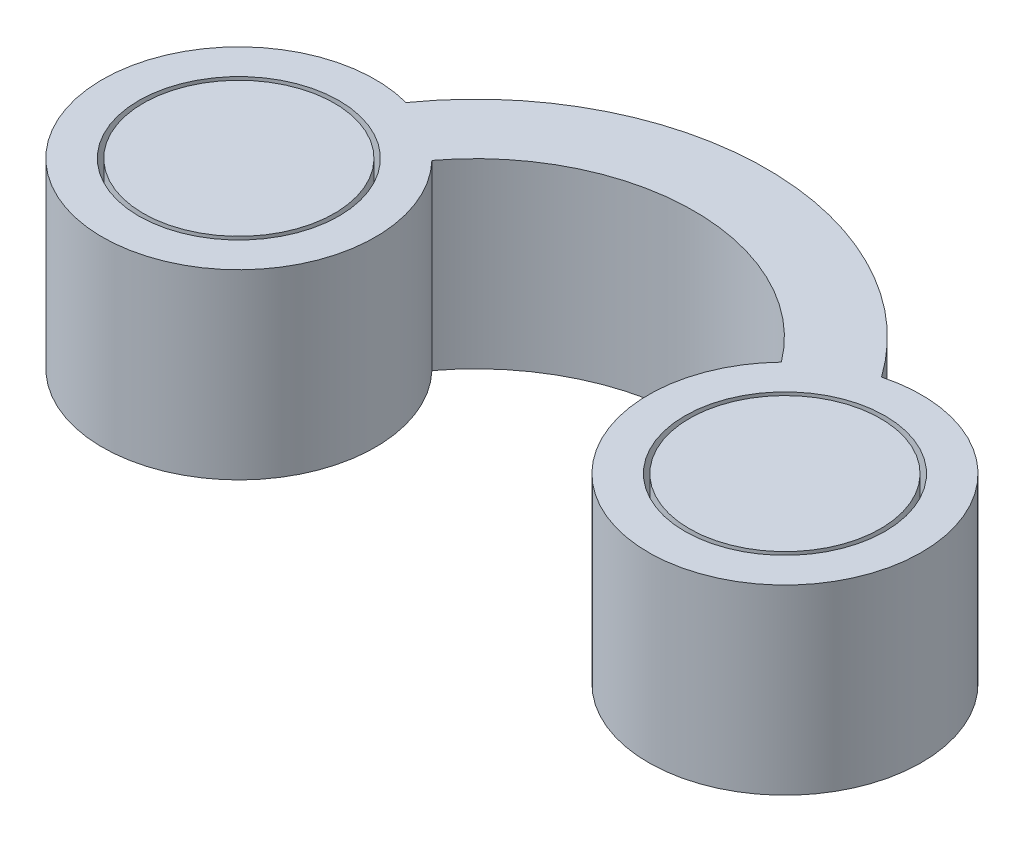
ISO-10303-21;
HEADER;
FILE_DESCRIPTION(('STEP AP214'),'2;1');
FILE_NAME('part.step','',(''),(''),'','','');
FILE_SCHEMA(('AUTOMOTIVE_DESIGN { 1 0 10303 214 1 1 1 1 }'));
ENDSEC;
DATA;
#1=APPLICATION_CONTEXT('core data for automotive mechanical design processes');
#2=APPLICATION_PROTOCOL_DEFINITION('international standard','automotive_design',2000,#1);
#3=PRODUCT_CONTEXT('',#1,'mechanical');
#4=PRODUCT('Part','Part','',(#3));
#5=PRODUCT_RELATED_PRODUCT_CATEGORY('part','',(#4));
#6=PRODUCT_DEFINITION_FORMATION('','',#4);
#7=PRODUCT_DEFINITION_CONTEXT('part definition',#1,'design');
#8=PRODUCT_DEFINITION('design','',#6,#7);
#9=PRODUCT_DEFINITION_SHAPE('','',#8);
#10=(LENGTH_UNIT() NAMED_UNIT(*) SI_UNIT(.MILLI.,.METRE.));
#11=(NAMED_UNIT(*) PLANE_ANGLE_UNIT() SI_UNIT($,.RADIAN.));
#12=(NAMED_UNIT(*) SI_UNIT($,.STERADIAN.) SOLID_ANGLE_UNIT());
#13=UNCERTAINTY_MEASURE_WITH_UNIT(LENGTH_MEASURE(1.E-05),#10,'distance_accuracy_value','');
#14=(GEOMETRIC_REPRESENTATION_CONTEXT(3) GLOBAL_UNCERTAINTY_ASSIGNED_CONTEXT((#13)) GLOBAL_UNIT_ASSIGNED_CONTEXT((#10,
#11,#12)) REPRESENTATION_CONTEXT('',''));
#15=CARTESIAN_POINT('',(0.,0.,0.));
#16=DIRECTION('',(0.,0.,1.));
#17=DIRECTION('',(1.,0.,0.));
#18=AXIS2_PLACEMENT_3D('',#15,#16,#17);
#19=CARTESIAN_POINT('',(-1.5,0.5,0.));
#20=DIRECTION('',(0.,-1.,0.));
#21=DIRECTION('',(0.,0.,-1.));
#22=AXIS2_PLACEMENT_3D('',#19,#20,#21);
#23=CYLINDRICAL_SURFACE('',#22,0.525);
#24=CARTESIAN_POINT('',(-1.5,0.5,0.));
#25=DIRECTION('',(0.,1.,0.));
#26=DIRECTION('',(0.,0.,1.));
#27=AXIS2_PLACEMENT_3D('',#24,#25,#26);
#28=CIRCLE('',#27,0.525);
#29=CARTESIAN_POINT('',(-1.5,0.5,0.525));
#30=VERTEX_POINT('',#29);
#31=EDGE_CURVE('E64',#30,#30,#28,.T.);
#32=ORIENTED_EDGE('',*,*,#31,.F.);
#33=EDGE_LOOP('',(#32));
#34=FACE_BOUND('',#33,.T.);
#35=CARTESIAN_POINT('',(-1.5,-0.5,0.));
#36=DIRECTION('',(0.,1.,0.));
#37=DIRECTION('',(0.,0.,1.));
#38=AXIS2_PLACEMENT_3D('',#35,#36,#37);
#39=CIRCLE('',#38,0.525);
#40=CARTESIAN_POINT('',(-1.5,-0.5,0.525));
#41=VERTEX_POINT('',#40);
#42=EDGE_CURVE('E11',#41,#41,#39,.T.);
#43=ORIENTED_EDGE('',*,*,#42,.T.);
#44=EDGE_LOOP('',(#43));
#45=FACE_BOUND('',#44,.T.);
#46=ADVANCED_FACE('F60',(#34,#45),#23,.T.);
#47=CARTESIAN_POINT('',(-1.5,0.5,0.));
#48=DIRECTION('',(0.,1.,0.));
#49=DIRECTION('',(0.,0.,1.));
#50=AXIS2_PLACEMENT_3D('',#47,#48,#49);
#51=PLANE('',#50);
#52=ORIENTED_EDGE('',*,*,#31,.T.);
#53=EDGE_LOOP('',(#52));
#54=FACE_BOUND('',#53,.T.);
#55=ADVANCED_FACE('F62',(#54),#51,.T.);
#56=CARTESIAN_POINT('',(-1.5,-0.5,0.));
#57=DIRECTION('',(0.,1.,0.));
#58=DIRECTION('',(0.,0.,1.));
#59=AXIS2_PLACEMENT_3D('',#56,#57,#58);
#60=PLANE('',#59);
#61=ORIENTED_EDGE('',*,*,#42,.F.);
#62=EDGE_LOOP('',(#61));
#63=FACE_BOUND('',#62,.T.);
#64=ADVANCED_FACE('F80',(#63),#60,.F.);
#65=CLOSED_SHELL('',(#46,#55,#64));
#66=MANIFOLD_SOLID_BREP('B2',#65);
#67=CARTESIAN_POINT('',(1.5,0.5,0.));
#68=DIRECTION('',(0.,-1.,0.));
#69=DIRECTION('',(0.,0.,-1.));
#70=AXIS2_PLACEMENT_3D('',#67,#68,#69);
#71=CYLINDRICAL_SURFACE('',#70,0.525);
#72=CARTESIAN_POINT('',(1.5,0.5,0.));
#73=DIRECTION('',(0.,1.,0.));
#74=DIRECTION('',(0.,0.,1.));
#75=AXIS2_PLACEMENT_3D('',#72,#73,#74);
#76=CIRCLE('',#75,0.525);
#77=CARTESIAN_POINT('',(1.5,0.5,0.525));
#78=VERTEX_POINT('',#77);
#79=EDGE_CURVE('E59',#78,#78,#76,.T.);
#80=ORIENTED_EDGE('',*,*,#79,.F.);
#81=EDGE_LOOP('',(#80));
#82=FACE_BOUND('',#81,.T.);
#83=CARTESIAN_POINT('',(1.5,-0.5,0.));
#84=DIRECTION('',(0.,1.,0.));
#85=DIRECTION('',(0.,0.,1.));
#86=AXIS2_PLACEMENT_3D('',#83,#84,#85);
#87=CIRCLE('',#86,0.525);
#88=CARTESIAN_POINT('',(1.5,-0.5,0.525));
#89=VERTEX_POINT('',#88);
#90=EDGE_CURVE('E119',#89,#89,#87,.T.);
#91=ORIENTED_EDGE('',*,*,#90,.T.);
#92=EDGE_LOOP('',(#91));
#93=FACE_BOUND('',#92,.T.);
#94=ADVANCED_FACE('F116',(#82,#93),#71,.T.);
#95=CARTESIAN_POINT('',(1.5,0.5,0.));
#96=DIRECTION('',(0.,1.,0.));
#97=DIRECTION('',(0.,0.,1.));
#98=AXIS2_PLACEMENT_3D('',#95,#96,#97);
#99=PLANE('',#98);
#100=ORIENTED_EDGE('',*,*,#79,.T.);
#101=EDGE_LOOP('',(#100));
#102=FACE_BOUND('',#101,.T.);
#103=ADVANCED_FACE('F131',(#102),#99,.T.);
#104=CARTESIAN_POINT('',(1.5,-0.5,0.));
#105=DIRECTION('',(0.,1.,0.));
#106=DIRECTION('',(0.,0.,1.));
#107=AXIS2_PLACEMENT_3D('',#104,#105,#106);
#108=PLANE('',#107);
#109=ORIENTED_EDGE('',*,*,#90,.F.);
#110=EDGE_LOOP('',(#109));
#111=FACE_BOUND('',#110,.T.);
#112=ADVANCED_FACE('F129',(#111),#108,.F.);
#113=CLOSED_SHELL('',(#94,#103,#112));
#114=MANIFOLD_SOLID_BREP('B6',#113);
#115=CARTESIAN_POINT('',(1.5,0.5,0.));
#116=DIRECTION('',(0.,-1.,0.));
#117=DIRECTION('',(0.,0.,-1.));
#118=AXIS2_PLACEMENT_3D('',#115,#116,#117);
#119=CYLINDRICAL_SURFACE('',#118,0.75);
#120=CARTESIAN_POINT('',(1.5,-0.5,0.));
#121=DIRECTION('',(0.,1.,0.));
#122=DIRECTION('',(0.,0.,1.));
#123=AXIS2_PLACEMENT_3D('',#120,#121,#122);
#124=CIRCLE('',#123,0.75);
#125=CARTESIAN_POINT('',(0.959797310143821,-0.5,-0.520270173921347));
#126=VERTEX_POINT('',#125);
#127=CARTESIAN_POINT('',(1.30590666884744,-0.5,-0.724449983644214));
#128=VERTEX_POINT('',#127);
#129=EDGE_CURVE('E240',#126,#128,#124,.T.);
#130=ORIENTED_EDGE('',*,*,#129,.T.);
#131=DIRECTION('',(0.,-1.,0.));
#132=VECTOR('',#131,1.);
#133=CARTESIAN_POINT('',(1.30590666884744,0.5,-0.724449983644214));
#134=LINE('',#133,#132);
#135=CARTESIAN_POINT('',(1.30590666884744,0.5,-0.724449983644214));
#136=VERTEX_POINT('',#135);
#137=EDGE_CURVE('E114',#136,#128,#134,.T.);
#138=ORIENTED_EDGE('',*,*,#137,.F.);
#139=CARTESIAN_POINT('',(1.5,0.5,0.));
#140=DIRECTION('',(0.,1.,0.));
#141=DIRECTION('',(0.,0.,1.));
#142=AXIS2_PLACEMENT_3D('',#139,#140,#141);
#143=CIRCLE('',#142,0.75);
#144=CARTESIAN_POINT('',(0.959797310143821,0.5,-0.520270173921347));
#145=VERTEX_POINT('',#144);
#146=EDGE_CURVE('E204',#145,#136,#143,.T.);
#147=ORIENTED_EDGE('',*,*,#146,.F.);
#148=DIRECTION('',(0.,-1.,0.));
#149=VECTOR('',#148,1.);
#150=CARTESIAN_POINT('',(0.959797310143821,0.5,-0.520270173921347));
#151=LINE('',#150,#149);
#152=EDGE_CURVE('E235',#145,#126,#151,.T.);
#153=ORIENTED_EDGE('',*,*,#152,.T.);
#154=EDGE_LOOP('',(#130,#138,#147,#153));
#155=FACE_BOUND('',#154,.T.);
#156=ADVANCED_FACE('F163',(#155),#119,.T.);
#157=CARTESIAN_POINT('',(0.,0.5,0.2));
#158=DIRECTION('',(0.,-1.,0.));
#159=DIRECTION('',(0.,0.,-1.));
#160=AXIS2_PLACEMENT_3D('',#157,#158,#159);
#161=CYLINDRICAL_SURFACE('',#160,1.6);
#162=CARTESIAN_POINT('',(0.,-0.5,0.2));
#163=DIRECTION('',(0.,1.,0.));
#164=DIRECTION('',(0.,0.,1.));
#165=AXIS2_PLACEMENT_3D('',#162,#163,#164);
#166=CIRCLE('',#165,1.6);
#167=CARTESIAN_POINT('',(-1.30590666884744,-0.5,-0.724449983644214));
#168=VERTEX_POINT('',#167);
#169=EDGE_CURVE('E213',#168,#128,#166,.F.);
#170=ORIENTED_EDGE('',*,*,#169,.F.);
#171=DIRECTION('',(0.,-1.,0.));
#172=VECTOR('',#171,1.);
#173=CARTESIAN_POINT('',(-1.30590666884744,0.5,-0.724449983644214));
#174=LINE('',#173,#172);
#175=CARTESIAN_POINT('',(-1.30590666884744,0.5,-0.724449983644214));
#176=VERTEX_POINT('',#175);
#177=EDGE_CURVE('E173',#176,#168,#174,.T.);
#178=ORIENTED_EDGE('',*,*,#177,.F.);
#179=CARTESIAN_POINT('',(0.,0.5,0.2));
#180=DIRECTION('',(0.,1.,0.));
#181=DIRECTION('',(0.,0.,1.));
#182=AXIS2_PLACEMENT_3D('',#179,#180,#181);
#183=CIRCLE('',#182,1.6);
#184=EDGE_CURVE('E211',#176,#136,#183,.F.);
#185=ORIENTED_EDGE('',*,*,#184,.T.);
#186=ORIENTED_EDGE('',*,*,#137,.T.);
#187=EDGE_LOOP('',(#170,#178,#185,#186));
#188=FACE_BOUND('',#187,.T.);
#189=ADVANCED_FACE('F210',(#188),#161,.T.);
#190=CARTESIAN_POINT('',(-1.5,0.5,0.));
#191=DIRECTION('',(0.,-1.,0.));
#192=DIRECTION('',(0.,0.,-1.));
#193=AXIS2_PLACEMENT_3D('',#190,#191,#192);
#194=CYLINDRICAL_SURFACE('',#193,0.75);
#195=CARTESIAN_POINT('',(-1.5,-0.5,0.));
#196=DIRECTION('',(0.,1.,0.));
#197=DIRECTION('',(0.,0.,1.));
#198=AXIS2_PLACEMENT_3D('',#195,#196,#197);
#199=CIRCLE('',#198,0.75);
#200=CARTESIAN_POINT('',(-0.959797310143821,-0.5,-0.520270173921347));
#201=VERTEX_POINT('',#200);
#202=EDGE_CURVE('E246',#201,#168,#199,.F.);
#203=ORIENTED_EDGE('',*,*,#202,.F.);
#204=DIRECTION('',(0.,-1.,0.));
#205=VECTOR('',#204,1.);
#206=CARTESIAN_POINT('',(-0.959797310143821,0.5,-0.520270173921347));
#207=LINE('',#206,#205);
#208=CARTESIAN_POINT('',(-0.959797310143821,0.5,-0.520270173921347));
#209=VERTEX_POINT('',#208);
#210=EDGE_CURVE('E196',#209,#201,#207,.T.);
#211=ORIENTED_EDGE('',*,*,#210,.F.);
#212=CARTESIAN_POINT('',(-1.5,0.5,0.));
#213=DIRECTION('',(0.,1.,0.));
#214=DIRECTION('',(0.,0.,1.));
#215=AXIS2_PLACEMENT_3D('',#212,#213,#214);
#216=CIRCLE('',#215,0.75);
#217=EDGE_CURVE('E221',#209,#176,#216,.F.);
#218=ORIENTED_EDGE('',*,*,#217,.T.);
#219=ORIENTED_EDGE('',*,*,#177,.T.);
#220=EDGE_LOOP('',(#203,#211,#218,#219));
#221=FACE_BOUND('',#220,.T.);
#222=ADVANCED_FACE('F224',(#221),#194,.T.);
#223=CARTESIAN_POINT('',(0.,0.5,0.2));
#224=DIRECTION('',(0.,-1.,0.));
#225=DIRECTION('',(0.,0.,-1.));
#226=AXIS2_PLACEMENT_3D('',#223,#224,#225);
#227=CYLINDRICAL_SURFACE('',#226,1.2);
#228=CARTESIAN_POINT('',(0.,-0.5,0.2));
#229=DIRECTION('',(0.,1.,0.));
#230=DIRECTION('',(0.,0.,1.));
#231=AXIS2_PLACEMENT_3D('',#228,#229,#230);
#232=CIRCLE('',#231,1.2);
#233=EDGE_CURVE('E199',#201,#126,#232,.F.);
#234=ORIENTED_EDGE('',*,*,#233,.T.);
#235=ORIENTED_EDGE('',*,*,#152,.F.);
#236=CARTESIAN_POINT('',(0.,0.5,0.2));
#237=DIRECTION('',(0.,1.,0.));
#238=DIRECTION('',(0.,0.,1.));
#239=AXIS2_PLACEMENT_3D('',#236,#237,#238);
#240=CIRCLE('',#239,1.2);
#241=EDGE_CURVE('E181',#209,#145,#240,.F.);
#242=ORIENTED_EDGE('',*,*,#241,.F.);
#243=ORIENTED_EDGE('',*,*,#210,.T.);
#244=EDGE_LOOP('',(#234,#235,#242,#243));
#245=FACE_BOUND('',#244,.T.);
#246=ADVANCED_FACE('F279',(#245),#227,.F.);
#247=CARTESIAN_POINT('',(1.5,0.5,0.));
#248=DIRECTION('',(0.,-1.,0.));
#249=DIRECTION('',(0.,0.,-1.));
#250=AXIS2_PLACEMENT_3D('',#247,#248,#249);
#251=CYLINDRICAL_SURFACE('',#250,0.55);
#252=CARTESIAN_POINT('',(1.5,0.5,0.));
#253=DIRECTION('',(0.,1.,0.));
#254=DIRECTION('',(0.,0.,1.));
#255=AXIS2_PLACEMENT_3D('',#252,#253,#254);
#256=CIRCLE('',#255,0.55);
#257=CARTESIAN_POINT('',(1.5,0.5,0.55));
#258=VERTEX_POINT('',#257);
#259=EDGE_CURVE('E255',#258,#258,#256,.T.);
#260=ORIENTED_EDGE('',*,*,#259,.T.);
#261=EDGE_LOOP('',(#260));
#262=FACE_BOUND('',#261,.T.);
#263=CARTESIAN_POINT('',(1.5,-0.5,0.));
#264=DIRECTION('',(0.,1.,0.));
#265=DIRECTION('',(0.,0.,1.));
#266=AXIS2_PLACEMENT_3D('',#263,#264,#265);
#267=CIRCLE('',#266,0.55);
#268=CARTESIAN_POINT('',(1.5,-0.5,0.55));
#269=VERTEX_POINT('',#268);
#270=EDGE_CURVE('E236',#269,#269,#267,.T.);
#271=ORIENTED_EDGE('',*,*,#270,.F.);
#272=EDGE_LOOP('',(#271));
#273=FACE_BOUND('',#272,.T.);
#274=ADVANCED_FACE('F165',(#262,#273),#251,.F.);
#275=CARTESIAN_POINT('',(-1.5,0.5,0.));
#276=DIRECTION('',(0.,-1.,0.));
#277=DIRECTION('',(0.,0.,-1.));
#278=AXIS2_PLACEMENT_3D('',#275,#276,#277);
#279=CYLINDRICAL_SURFACE('',#278,0.55);
#280=CARTESIAN_POINT('',(-1.5,0.5,0.));
#281=DIRECTION('',(0.,1.,0.));
#282=DIRECTION('',(0.,0.,1.));
#283=AXIS2_PLACEMENT_3D('',#280,#281,#282);
#284=CIRCLE('',#283,0.55);
#285=CARTESIAN_POINT('',(-1.5,0.5,0.55));
#286=VERTEX_POINT('',#285);
#287=EDGE_CURVE('E228',#286,#286,#284,.F.);
#288=ORIENTED_EDGE('',*,*,#287,.F.);
#289=EDGE_LOOP('',(#288));
#290=FACE_BOUND('',#289,.T.);
#291=CARTESIAN_POINT('',(-1.5,-0.5,0.));
#292=DIRECTION('',(0.,1.,0.));
#293=DIRECTION('',(0.,0.,1.));
#294=AXIS2_PLACEMENT_3D('',#291,#292,#293);
#295=CIRCLE('',#294,0.55);
#296=CARTESIAN_POINT('',(-1.5,-0.5,0.55));
#297=VERTEX_POINT('',#296);
#298=EDGE_CURVE('E251',#297,#297,#295,.F.);
#299=ORIENTED_EDGE('',*,*,#298,.T.);
#300=EDGE_LOOP('',(#299));
#301=FACE_BOUND('',#300,.T.);
#302=ADVANCED_FACE('F269',(#290,#301),#279,.F.);
#303=CARTESIAN_POINT('',(0.,0.5,0.));
#304=DIRECTION('',(0.,1.,0.));
#305=DIRECTION('',(0.,0.,1.));
#306=AXIS2_PLACEMENT_3D('',#303,#304,#305);
#307=PLANE('',#306);
#308=ORIENTED_EDGE('',*,*,#259,.F.);
#309=EDGE_LOOP('',(#308));
#310=FACE_BOUND('',#309,.T.);
#311=ORIENTED_EDGE('',*,*,#146,.T.);
#312=ORIENTED_EDGE('',*,*,#184,.F.);
#313=ORIENTED_EDGE('',*,*,#217,.F.);
#314=ORIENTED_EDGE('',*,*,#241,.T.);
#315=EDGE_LOOP('',(#311,#312,#313,#314));
#316=FACE_BOUND('',#315,.T.);
#317=ORIENTED_EDGE('',*,*,#287,.T.);
#318=EDGE_LOOP('',(#317));
#319=FACE_BOUND('',#318,.T.);
#320=ADVANCED_FACE('F219',(#310,#316,#319),#307,.T.);
#321=CARTESIAN_POINT('',(0.,-0.5,0.));
#322=DIRECTION('',(0.,1.,0.));
#323=DIRECTION('',(0.,0.,1.));
#324=AXIS2_PLACEMENT_3D('',#321,#322,#323);
#325=PLANE('',#324);
#326=ORIENTED_EDGE('',*,*,#270,.T.);
#327=EDGE_LOOP('',(#326));
#328=FACE_BOUND('',#327,.T.);
#329=ORIENTED_EDGE('',*,*,#129,.F.);
#330=ORIENTED_EDGE('',*,*,#233,.F.);
#331=ORIENTED_EDGE('',*,*,#202,.T.);
#332=ORIENTED_EDGE('',*,*,#169,.T.);
#333=EDGE_LOOP('',(#329,#330,#331,#332));
#334=FACE_BOUND('',#333,.T.);
#335=ORIENTED_EDGE('',*,*,#298,.F.);
#336=EDGE_LOOP('',(#335));
#337=FACE_BOUND('',#336,.T.);
#338=ADVANCED_FACE('F262',(#328,#334,#337),#325,.F.);
#339=CLOSED_SHELL('',(#156,#189,#222,#246,#274,#302,#320,#338));
#340=MANIFOLD_SOLID_BREP('B54',#339);
#341=ADVANCED_BREP_SHAPE_REPRESENTATION('',(#18,#66,#114,#340),#14);
#342=SHAPE_DEFINITION_REPRESENTATION(#9,#341);
ENDSEC;
END-ISO-10303-21;
